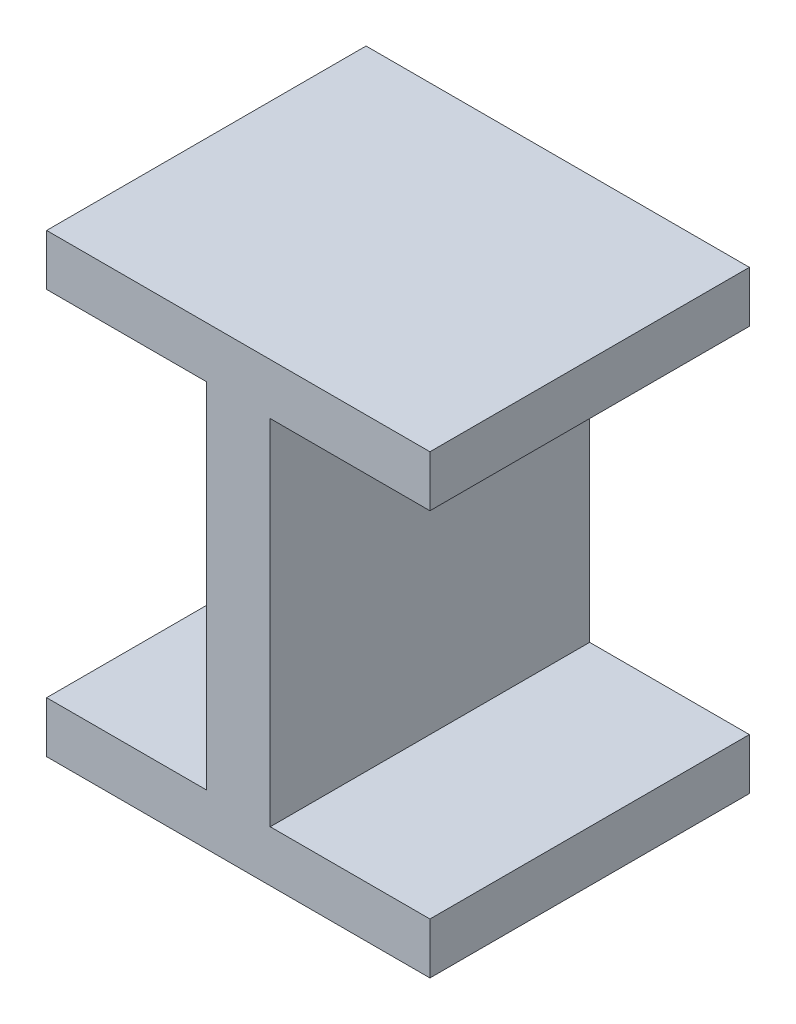
ISO-10303-21;
HEADER;
FILE_DESCRIPTION(('STEP AP214'),'2;1');
FILE_NAME('part.step','',(''),(''),'','','');
FILE_SCHEMA(('AUTOMOTIVE_DESIGN { 1 0 10303 214 1 1 1 1 }'));
ENDSEC;
DATA;
#1=APPLICATION_CONTEXT('core data for automotive mechanical design processes');
#2=APPLICATION_PROTOCOL_DEFINITION('international standard','automotive_design',2000,#1);
#3=PRODUCT_CONTEXT('',#1,'mechanical');
#4=PRODUCT('Part','Part','',(#3));
#5=PRODUCT_RELATED_PRODUCT_CATEGORY('part','',(#4));
#6=PRODUCT_DEFINITION_FORMATION('','',#4);
#7=PRODUCT_DEFINITION_CONTEXT('part definition',#1,'design');
#8=PRODUCT_DEFINITION('design','',#6,#7);
#9=PRODUCT_DEFINITION_SHAPE('','',#8);
#10=(LENGTH_UNIT() NAMED_UNIT(*) SI_UNIT(.MILLI.,.METRE.));
#11=(NAMED_UNIT(*) PLANE_ANGLE_UNIT() SI_UNIT($,.RADIAN.));
#12=(NAMED_UNIT(*) SI_UNIT($,.STERADIAN.) SOLID_ANGLE_UNIT());
#13=UNCERTAINTY_MEASURE_WITH_UNIT(LENGTH_MEASURE(1.E-05),#10,'distance_accuracy_value','');
#14=(GEOMETRIC_REPRESENTATION_CONTEXT(3) GLOBAL_UNCERTAINTY_ASSIGNED_CONTEXT((#13)) GLOBAL_UNIT_ASSIGNED_CONTEXT((#10,
#11,#12)) REPRESENTATION_CONTEXT('',''));
#15=CARTESIAN_POINT('',(0.,0.,0.));
#16=DIRECTION('',(0.,0.,1.));
#17=DIRECTION('',(1.,0.,0.));
#18=AXIS2_PLACEMENT_3D('',#15,#16,#17);
#19=CARTESIAN_POINT('',(-30.,0.,50.));
#20=DIRECTION('',(1.,0.,0.));
#21=DIRECTION('',(0.,0.,-1.));
#22=AXIS2_PLACEMENT_3D('',#19,#20,#21);
#23=PLANE('',#22);
#24=DIRECTION('',(0.,-1.,0.));
#25=VECTOR('',#24,1.);
#26=CARTESIAN_POINT('',(-30.,0.,0.));
#27=LINE('',#26,#25);
#28=CARTESIAN_POINT('',(-30.,-27.669066156319,0.));
#29=VERTEX_POINT('',#28);
#30=CARTESIAN_POINT('',(-30.,-35.6690661563189,0.));
#31=VERTEX_POINT('',#30);
#32=EDGE_CURVE('E169',#29,#31,#27,.T.);
#33=ORIENTED_EDGE('',*,*,#32,.T.);
#34=DIRECTION('',(0.,0.,-1.));
#35=VECTOR('',#34,1.);
#36=CARTESIAN_POINT('',(-30.,-35.6690661563189,50.));
#37=LINE('',#36,#35);
#38=CARTESIAN_POINT('',(-30.,-35.6690661563189,50.));
#39=VERTEX_POINT('',#38);
#40=EDGE_CURVE('E11',#39,#31,#37,.T.);
#41=ORIENTED_EDGE('',*,*,#40,.F.);
#42=DIRECTION('',(0.,-1.,0.));
#43=VECTOR('',#42,1.);
#44=CARTESIAN_POINT('',(-30.,0.,50.));
#45=LINE('',#44,#43);
#46=CARTESIAN_POINT('',(-30.,-27.669066156319,50.));
#47=VERTEX_POINT('',#46);
#48=EDGE_CURVE('E208',#47,#39,#45,.T.);
#49=ORIENTED_EDGE('',*,*,#48,.F.);
#50=DIRECTION('',(0.,0.,-1.));
#51=VECTOR('',#50,1.);
#52=CARTESIAN_POINT('',(-30.,-27.669066156319,50.));
#53=LINE('',#52,#51);
#54=EDGE_CURVE('E168',#47,#29,#53,.T.);
#55=ORIENTED_EDGE('',*,*,#54,.T.);
#56=EDGE_LOOP('',(#33,#41,#49,#55));
#57=FACE_BOUND('',#56,.T.);
#58=ADVANCED_FACE('F39',(#57),#23,.F.);
#59=CARTESIAN_POINT('',(0.,-35.6690661563189,50.));
#60=DIRECTION('',(0.,1.,0.));
#61=DIRECTION('',(0.,0.,1.));
#62=AXIS2_PLACEMENT_3D('',#59,#60,#61);
#63=PLANE('',#62);
#64=DIRECTION('',(1.,0.,0.));
#65=VECTOR('',#64,1.);
#66=CARTESIAN_POINT('',(0.,-35.6690661563189,0.));
#67=LINE('',#66,#65);
#68=CARTESIAN_POINT('',(30.,-35.6690661563189,0.));
#69=VERTEX_POINT('',#68);
#70=EDGE_CURVE('E173',#31,#69,#67,.T.);
#71=ORIENTED_EDGE('',*,*,#70,.T.);
#72=DIRECTION('',(0.,0.,-1.));
#73=VECTOR('',#72,1.);
#74=CARTESIAN_POINT('',(30.,-35.6690661563189,50.));
#75=LINE('',#74,#73);
#76=CARTESIAN_POINT('',(30.,-35.6690661563189,50.));
#77=VERTEX_POINT('',#76);
#78=EDGE_CURVE('E48',#77,#69,#75,.T.);
#79=ORIENTED_EDGE('',*,*,#78,.F.);
#80=DIRECTION('',(1.,0.,0.));
#81=VECTOR('',#80,1.);
#82=CARTESIAN_POINT('',(0.,-35.6690661563189,50.));
#83=LINE('',#82,#81);
#84=EDGE_CURVE('E110',#39,#77,#83,.T.);
#85=ORIENTED_EDGE('',*,*,#84,.F.);
#86=ORIENTED_EDGE('',*,*,#40,.T.);
#87=EDGE_LOOP('',(#71,#79,#85,#86));
#88=FACE_BOUND('',#87,.T.);
#89=ADVANCED_FACE('F240',(#88),#63,.F.);
#90=CARTESIAN_POINT('',(30.,0.,50.));
#91=DIRECTION('',(1.,0.,0.));
#92=DIRECTION('',(0.,0.,-1.));
#93=AXIS2_PLACEMENT_3D('',#90,#91,#92);
#94=PLANE('',#93);
#95=DIRECTION('',(0.,-1.,0.));
#96=VECTOR('',#95,1.);
#97=CARTESIAN_POINT('',(30.,0.,0.));
#98=LINE('',#97,#96);
#99=CARTESIAN_POINT('',(30.,-27.669066156319,0.));
#100=VERTEX_POINT('',#99);
#101=EDGE_CURVE('E177',#100,#69,#98,.T.);
#102=ORIENTED_EDGE('',*,*,#101,.F.);
#103=DIRECTION('',(0.,0.,-1.));
#104=VECTOR('',#103,1.);
#105=CARTESIAN_POINT('',(30.,-27.669066156319,50.));
#106=LINE('',#105,#104);
#107=CARTESIAN_POINT('',(30.,-27.669066156319,50.));
#108=VERTEX_POINT('',#107);
#109=EDGE_CURVE('E231',#108,#100,#106,.T.);
#110=ORIENTED_EDGE('',*,*,#109,.F.);
#111=DIRECTION('',(0.,-1.,0.));
#112=VECTOR('',#111,1.);
#113=CARTESIAN_POINT('',(30.,0.,50.));
#114=LINE('',#113,#112);
#115=EDGE_CURVE('E239',#108,#77,#114,.T.);
#116=ORIENTED_EDGE('',*,*,#115,.T.);
#117=ORIENTED_EDGE('',*,*,#78,.T.);
#118=EDGE_LOOP('',(#102,#110,#116,#117));
#119=FACE_BOUND('',#118,.T.);
#120=ADVANCED_FACE('F237',(#119),#94,.T.);
#121=CARTESIAN_POINT('',(0.,-27.669066156319,50.));
#122=DIRECTION('',(0.,1.,0.));
#123=DIRECTION('',(-1.,0.,0.));
#124=AXIS2_PLACEMENT_3D('',#121,#122,#123);
#125=PLANE('',#124);
#126=DIRECTION('',(1.,0.,0.));
#127=VECTOR('',#126,1.);
#128=CARTESIAN_POINT('',(0.,-27.669066156319,0.));
#129=LINE('',#128,#127);
#130=CARTESIAN_POINT('',(5.00000000000001,-27.669066156319,0.));
#131=VERTEX_POINT('',#130);
#132=EDGE_CURVE('E180',#131,#100,#129,.T.);
#133=ORIENTED_EDGE('',*,*,#132,.F.);
#134=DIRECTION('',(0.,0.,-1.));
#135=VECTOR('',#134,1.);
#136=CARTESIAN_POINT('',(5.00000000000001,-27.669066156319,50.));
#137=LINE('',#136,#135);
#138=CARTESIAN_POINT('',(5.00000000000001,-27.669066156319,50.));
#139=VERTEX_POINT('',#138);
#140=EDGE_CURVE('E229',#139,#131,#137,.T.);
#141=ORIENTED_EDGE('',*,*,#140,.F.);
#142=DIRECTION('',(1.,0.,0.));
#143=VECTOR('',#142,1.);
#144=CARTESIAN_POINT('',(0.,-27.669066156319,50.));
#145=LINE('',#144,#143);
#146=EDGE_CURVE('E253',#139,#108,#145,.T.);
#147=ORIENTED_EDGE('',*,*,#146,.T.);
#148=ORIENTED_EDGE('',*,*,#109,.T.);
#149=EDGE_LOOP('',(#133,#141,#147,#148));
#150=FACE_BOUND('',#149,.T.);
#151=ADVANCED_FACE('F249',(#150),#125,.T.);
#152=CARTESIAN_POINT('',(5.00000000000001,0.,50.));
#153=DIRECTION('',(-1.,0.,0.));
#154=DIRECTION('',(0.,0.,1.));
#155=AXIS2_PLACEMENT_3D('',#152,#153,#154);
#156=PLANE('',#155);
#157=DIRECTION('',(0.,1.,0.));
#158=VECTOR('',#157,1.);
#159=CARTESIAN_POINT('',(5.00000000000001,0.,0.));
#160=LINE('',#159,#158);
#161=CARTESIAN_POINT('',(5.00000000000001,27.669066156319,0.));
#162=VERTEX_POINT('',#161);
#163=EDGE_CURVE('E184',#131,#162,#160,.T.);
#164=ORIENTED_EDGE('',*,*,#163,.T.);
#165=DIRECTION('',(0.,0.,-1.));
#166=VECTOR('',#165,1.);
#167=CARTESIAN_POINT('',(5.00000000000001,27.669066156319,50.));
#168=LINE('',#167,#166);
#169=CARTESIAN_POINT('',(5.00000000000001,27.669066156319,50.));
#170=VERTEX_POINT('',#169);
#171=EDGE_CURVE('E225',#170,#162,#168,.T.);
#172=ORIENTED_EDGE('',*,*,#171,.F.);
#173=DIRECTION('',(0.,1.,0.));
#174=VECTOR('',#173,1.);
#175=CARTESIAN_POINT('',(5.00000000000001,0.,50.));
#176=LINE('',#175,#174);
#177=EDGE_CURVE('E258',#139,#170,#176,.T.);
#178=ORIENTED_EDGE('',*,*,#177,.F.);
#179=ORIENTED_EDGE('',*,*,#140,.T.);
#180=EDGE_LOOP('',(#164,#172,#178,#179));
#181=FACE_BOUND('',#180,.T.);
#182=ADVANCED_FACE('F303',(#181),#156,.F.);
#183=CARTESIAN_POINT('',(0.,27.669066156319,50.));
#184=DIRECTION('',(0.,1.,0.));
#185=DIRECTION('',(-1.,0.,0.));
#186=AXIS2_PLACEMENT_3D('',#183,#184,#185);
#187=PLANE('',#186);
#188=DIRECTION('',(1.,0.,0.));
#189=VECTOR('',#188,1.);
#190=CARTESIAN_POINT('',(0.,27.669066156319,0.));
#191=LINE('',#190,#189);
#192=CARTESIAN_POINT('',(30.,27.669066156319,0.));
#193=VERTEX_POINT('',#192);
#194=EDGE_CURVE('E187',#162,#193,#191,.T.);
#195=ORIENTED_EDGE('',*,*,#194,.T.);
#196=DIRECTION('',(0.,0.,-1.));
#197=VECTOR('',#196,1.);
#198=CARTESIAN_POINT('',(30.,27.669066156319,50.));
#199=LINE('',#198,#197);
#200=CARTESIAN_POINT('',(30.,27.669066156319,50.));
#201=VERTEX_POINT('',#200);
#202=EDGE_CURVE('E221',#201,#193,#199,.T.);
#203=ORIENTED_EDGE('',*,*,#202,.F.);
#204=DIRECTION('',(1.,0.,0.));
#205=VECTOR('',#204,1.);
#206=CARTESIAN_POINT('',(0.,27.669066156319,50.));
#207=LINE('',#206,#205);
#208=EDGE_CURVE('E266',#170,#201,#207,.T.);
#209=ORIENTED_EDGE('',*,*,#208,.F.);
#210=ORIENTED_EDGE('',*,*,#171,.T.);
#211=EDGE_LOOP('',(#195,#203,#209,#210));
#212=FACE_BOUND('',#211,.T.);
#213=ADVANCED_FACE('F306',(#212),#187,.F.);
#214=CARTESIAN_POINT('',(30.,0.,50.));
#215=DIRECTION('',(-1.,0.,0.));
#216=DIRECTION('',(0.,0.,1.));
#217=AXIS2_PLACEMENT_3D('',#214,#215,#216);
#218=PLANE('',#217);
#219=DIRECTION('',(0.,1.,0.));
#220=VECTOR('',#219,1.);
#221=CARTESIAN_POINT('',(30.,0.,0.));
#222=LINE('',#221,#220);
#223=CARTESIAN_POINT('',(30.,35.6690661563189,0.));
#224=VERTEX_POINT('',#223);
#225=EDGE_CURVE('E190',#193,#224,#222,.T.);
#226=ORIENTED_EDGE('',*,*,#225,.T.);
#227=DIRECTION('',(0.,0.,-1.));
#228=VECTOR('',#227,1.);
#229=CARTESIAN_POINT('',(30.,35.6690661563189,50.));
#230=LINE('',#229,#228);
#231=CARTESIAN_POINT('',(30.,35.6690661563189,50.));
#232=VERTEX_POINT('',#231);
#233=EDGE_CURVE('E218',#232,#224,#230,.T.);
#234=ORIENTED_EDGE('',*,*,#233,.F.);
#235=DIRECTION('',(0.,1.,0.));
#236=VECTOR('',#235,1.);
#237=CARTESIAN_POINT('',(30.,0.,50.));
#238=LINE('',#237,#236);
#239=EDGE_CURVE('E268',#201,#232,#238,.T.);
#240=ORIENTED_EDGE('',*,*,#239,.F.);
#241=ORIENTED_EDGE('',*,*,#202,.T.);
#242=EDGE_LOOP('',(#226,#234,#240,#241));
#243=FACE_BOUND('',#242,.T.);
#244=ADVANCED_FACE('F310',(#243),#218,.F.);
#245=CARTESIAN_POINT('',(0.,35.6690661563189,50.));
#246=DIRECTION('',(0.,1.,0.));
#247=DIRECTION('',(0.,0.,1.));
#248=AXIS2_PLACEMENT_3D('',#245,#246,#247);
#249=PLANE('',#248);
#250=DIRECTION('',(1.,0.,0.));
#251=VECTOR('',#250,1.);
#252=CARTESIAN_POINT('',(0.,35.6690661563189,0.));
#253=LINE('',#252,#251);
#254=CARTESIAN_POINT('',(-30.,35.6690661563189,0.));
#255=VERTEX_POINT('',#254);
#256=EDGE_CURVE('E194',#255,#224,#253,.T.);
#257=ORIENTED_EDGE('',*,*,#256,.F.);
#258=DIRECTION('',(0.,0.,-1.));
#259=VECTOR('',#258,1.);
#260=CARTESIAN_POINT('',(-30.,35.6690661563189,50.));
#261=LINE('',#260,#259);
#262=CARTESIAN_POINT('',(-30.,35.6690661563189,50.));
#263=VERTEX_POINT('',#262);
#264=EDGE_CURVE('E215',#263,#255,#261,.T.);
#265=ORIENTED_EDGE('',*,*,#264,.F.);
#266=DIRECTION('',(1.,0.,0.));
#267=VECTOR('',#266,1.);
#268=CARTESIAN_POINT('',(0.,35.6690661563189,50.));
#269=LINE('',#268,#267);
#270=EDGE_CURVE('E162',#263,#232,#269,.T.);
#271=ORIENTED_EDGE('',*,*,#270,.T.);
#272=ORIENTED_EDGE('',*,*,#233,.T.);
#273=EDGE_LOOP('',(#257,#265,#271,#272));
#274=FACE_BOUND('',#273,.T.);
#275=ADVANCED_FACE('F274',(#274),#249,.T.);
#276=CARTESIAN_POINT('',(-30.,0.,50.));
#277=DIRECTION('',(-1.,0.,0.));
#278=DIRECTION('',(0.,0.,1.));
#279=AXIS2_PLACEMENT_3D('',#276,#277,#278);
#280=PLANE('',#279);
#281=DIRECTION('',(0.,1.,0.));
#282=VECTOR('',#281,1.);
#283=CARTESIAN_POINT('',(-30.,0.,0.));
#284=LINE('',#283,#282);
#285=CARTESIAN_POINT('',(-30.,27.669066156319,0.));
#286=VERTEX_POINT('',#285);
#287=EDGE_CURVE('E198',#286,#255,#284,.T.);
#288=ORIENTED_EDGE('',*,*,#287,.F.);
#289=DIRECTION('',(0.,0.,-1.));
#290=VECTOR('',#289,1.);
#291=CARTESIAN_POINT('',(-30.,27.669066156319,50.));
#292=LINE('',#291,#290);
#293=CARTESIAN_POINT('',(-30.,27.669066156319,50.));
#294=VERTEX_POINT('',#293);
#295=EDGE_CURVE('E145',#294,#286,#292,.T.);
#296=ORIENTED_EDGE('',*,*,#295,.F.);
#297=DIRECTION('',(0.,1.,0.));
#298=VECTOR('',#297,1.);
#299=CARTESIAN_POINT('',(-30.,0.,50.));
#300=LINE('',#299,#298);
#301=EDGE_CURVE('E156',#294,#263,#300,.T.);
#302=ORIENTED_EDGE('',*,*,#301,.T.);
#303=ORIENTED_EDGE('',*,*,#264,.T.);
#304=EDGE_LOOP('',(#288,#296,#302,#303));
#305=FACE_BOUND('',#304,.T.);
#306=ADVANCED_FACE('F279',(#305),#280,.T.);
#307=CARTESIAN_POINT('',(0.,27.669066156319,50.));
#308=DIRECTION('',(0.,-1.,0.));
#309=DIRECTION('',(1.,0.,0.));
#310=AXIS2_PLACEMENT_3D('',#307,#308,#309);
#311=PLANE('',#310);
#312=DIRECTION('',(-1.,0.,0.));
#313=VECTOR('',#312,1.);
#314=CARTESIAN_POINT('',(0.,27.669066156319,0.));
#315=LINE('',#314,#313);
#316=CARTESIAN_POINT('',(-5.00000000000001,27.669066156319,0.));
#317=VERTEX_POINT('',#316);
#318=EDGE_CURVE('E143',#317,#286,#315,.T.);
#319=ORIENTED_EDGE('',*,*,#318,.F.);
#320=DIRECTION('',(0.,0.,-1.));
#321=VECTOR('',#320,1.);
#322=CARTESIAN_POINT('',(-5.00000000000001,27.669066156319,50.));
#323=LINE('',#322,#321);
#324=CARTESIAN_POINT('',(-5.00000000000001,27.669066156319,50.));
#325=VERTEX_POINT('',#324);
#326=EDGE_CURVE('E137',#325,#317,#323,.T.);
#327=ORIENTED_EDGE('',*,*,#326,.F.);
#328=DIRECTION('',(-1.,0.,0.));
#329=VECTOR('',#328,1.);
#330=CARTESIAN_POINT('',(0.,27.669066156319,50.));
#331=LINE('',#330,#329);
#332=EDGE_CURVE('E141',#325,#294,#331,.T.);
#333=ORIENTED_EDGE('',*,*,#332,.T.);
#334=ORIENTED_EDGE('',*,*,#295,.T.);
#335=EDGE_LOOP('',(#319,#327,#333,#334));
#336=FACE_BOUND('',#335,.T.);
#337=ADVANCED_FACE('F139',(#336),#311,.T.);
#338=CARTESIAN_POINT('',(-5.,0.,50.));
#339=DIRECTION('',(1.,0.,0.));
#340=DIRECTION('',(0.,1.,0.));
#341=AXIS2_PLACEMENT_3D('',#338,#339,#340);
#342=PLANE('',#341);
#343=DIRECTION('',(0.,-1.,0.));
#344=VECTOR('',#343,1.);
#345=CARTESIAN_POINT('',(-5.,0.,0.));
#346=LINE('',#345,#344);
#347=CARTESIAN_POINT('',(-4.99999999999999,-27.669066156319,0.));
#348=VERTEX_POINT('',#347);
#349=EDGE_CURVE('E96',#317,#348,#346,.T.);
#350=ORIENTED_EDGE('',*,*,#349,.T.);
#351=DIRECTION('',(0.,0.,-1.));
#352=VECTOR('',#351,1.);
#353=CARTESIAN_POINT('',(-4.99999999999999,-27.669066156319,50.));
#354=LINE('',#353,#352);
#355=CARTESIAN_POINT('',(-4.99999999999999,-27.669066156319,50.));
#356=VERTEX_POINT('',#355);
#357=EDGE_CURVE('E146',#356,#348,#354,.T.);
#358=ORIENTED_EDGE('',*,*,#357,.F.);
#359=DIRECTION('',(0.,-1.,0.));
#360=VECTOR('',#359,1.);
#361=CARTESIAN_POINT('',(-5.,0.,50.));
#362=LINE('',#361,#360);
#363=EDGE_CURVE('E148',#325,#356,#362,.T.);
#364=ORIENTED_EDGE('',*,*,#363,.F.);
#365=ORIENTED_EDGE('',*,*,#326,.T.);
#366=EDGE_LOOP('',(#350,#358,#364,#365));
#367=FACE_BOUND('',#366,.T.);
#368=ADVANCED_FACE('F149',(#367),#342,.F.);
#369=CARTESIAN_POINT('',(0.,-27.669066156319,50.));
#370=DIRECTION('',(0.,-1.,0.));
#371=DIRECTION('',(1.,0.,0.));
#372=AXIS2_PLACEMENT_3D('',#369,#370,#371);
#373=PLANE('',#372);
#374=DIRECTION('',(-1.,0.,0.));
#375=VECTOR('',#374,1.);
#376=CARTESIAN_POINT('',(0.,-27.669066156319,0.));
#377=LINE('',#376,#375);
#378=EDGE_CURVE('E102',#348,#29,#377,.T.);
#379=ORIENTED_EDGE('',*,*,#378,.T.);
#380=ORIENTED_EDGE('',*,*,#54,.F.);
#381=DIRECTION('',(-1.,0.,0.));
#382=VECTOR('',#381,1.);
#383=CARTESIAN_POINT('',(0.,-27.669066156319,50.));
#384=LINE('',#383,#382);
#385=EDGE_CURVE('E56',#356,#47,#384,.T.);
#386=ORIENTED_EDGE('',*,*,#385,.F.);
#387=ORIENTED_EDGE('',*,*,#357,.T.);
#388=EDGE_LOOP('',(#379,#380,#386,#387));
#389=FACE_BOUND('',#388,.T.);
#390=ADVANCED_FACE('F282',(#389),#373,.F.);
#391=CARTESIAN_POINT('',(0.,0.,50.));
#392=DIRECTION('',(0.,0.,1.));
#393=DIRECTION('',(1.,0.,0.));
#394=AXIS2_PLACEMENT_3D('',#391,#392,#393);
#395=PLANE('',#394);
#396=ORIENTED_EDGE('',*,*,#48,.T.);
#397=ORIENTED_EDGE('',*,*,#84,.T.);
#398=ORIENTED_EDGE('',*,*,#115,.F.);
#399=ORIENTED_EDGE('',*,*,#146,.F.);
#400=ORIENTED_EDGE('',*,*,#177,.T.);
#401=ORIENTED_EDGE('',*,*,#208,.T.);
#402=ORIENTED_EDGE('',*,*,#239,.T.);
#403=ORIENTED_EDGE('',*,*,#270,.F.);
#404=ORIENTED_EDGE('',*,*,#301,.F.);
#405=ORIENTED_EDGE('',*,*,#332,.F.);
#406=ORIENTED_EDGE('',*,*,#363,.T.);
#407=ORIENTED_EDGE('',*,*,#385,.T.);
#408=EDGE_LOOP('',(#396,#397,#398,#399,#400,#401,#402,#403,#404,#405,#406,#407));
#409=FACE_BOUND('',#408,.T.);
#410=ADVANCED_FACE('F153',(#409),#395,.T.);
#411=CARTESIAN_POINT('',(0.,0.,0.));
#412=DIRECTION('',(0.,0.,1.));
#413=DIRECTION('',(1.,0.,0.));
#414=AXIS2_PLACEMENT_3D('',#411,#412,#413);
#415=PLANE('',#414);
#416=ORIENTED_EDGE('',*,*,#32,.F.);
#417=ORIENTED_EDGE('',*,*,#378,.F.);
#418=ORIENTED_EDGE('',*,*,#349,.F.);
#419=ORIENTED_EDGE('',*,*,#318,.T.);
#420=ORIENTED_EDGE('',*,*,#287,.T.);
#421=ORIENTED_EDGE('',*,*,#256,.T.);
#422=ORIENTED_EDGE('',*,*,#225,.F.);
#423=ORIENTED_EDGE('',*,*,#194,.F.);
#424=ORIENTED_EDGE('',*,*,#163,.F.);
#425=ORIENTED_EDGE('',*,*,#132,.T.);
#426=ORIENTED_EDGE('',*,*,#101,.T.);
#427=ORIENTED_EDGE('',*,*,#70,.F.);
#428=EDGE_LOOP('',(#416,#417,#418,#419,#420,#421,#422,#423,#424,#425,#426,#427));
#429=FACE_BOUND('',#428,.T.);
#430=ADVANCED_FACE('F244',(#429),#415,.F.);
#431=CLOSED_SHELL('',(#58,#89,#120,#151,#182,#213,#244,#275,#306,#337,#368,#390,#410,#430));
#432=MANIFOLD_SOLID_BREP('B2',#431);
#433=ADVANCED_BREP_SHAPE_REPRESENTATION('',(#18,#432),#14);
#434=SHAPE_DEFINITION_REPRESENTATION(#9,#433);
ENDSEC;
END-ISO-10303-21;
